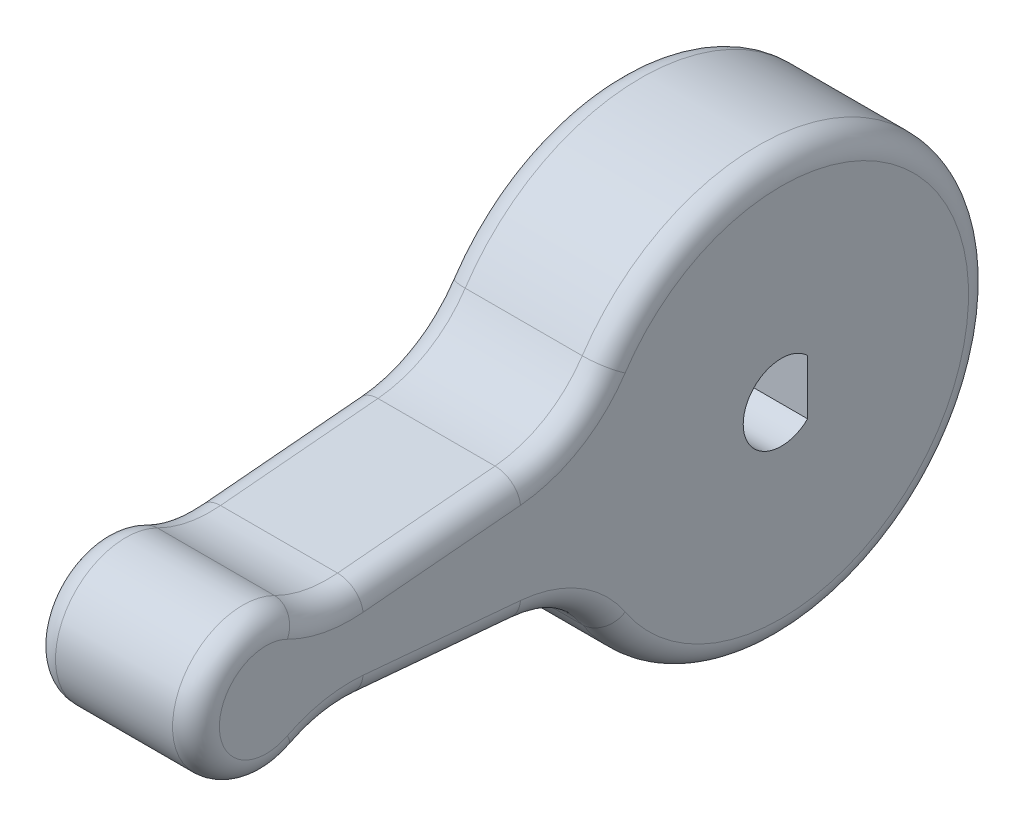
ISO-10303-21;
HEADER;
FILE_DESCRIPTION(('STEP AP214'),'2;1');
FILE_NAME('part.step','',(''),(''),'','','');
FILE_SCHEMA(('AUTOMOTIVE_DESIGN { 1 0 10303 214 1 1 1 1 }'));
ENDSEC;
DATA;
#1=APPLICATION_CONTEXT('core data for automotive mechanical design processes');
#2=APPLICATION_PROTOCOL_DEFINITION('international standard','automotive_design',2000,#1);
#3=PRODUCT_CONTEXT('',#1,'mechanical');
#4=PRODUCT('Part','Part','',(#3));
#5=PRODUCT_RELATED_PRODUCT_CATEGORY('part','',(#4));
#6=PRODUCT_DEFINITION_FORMATION('','',#4);
#7=PRODUCT_DEFINITION_CONTEXT('part definition',#1,'design');
#8=PRODUCT_DEFINITION('design','',#6,#7);
#9=PRODUCT_DEFINITION_SHAPE('','',#8);
#10=(LENGTH_UNIT() NAMED_UNIT(*) SI_UNIT(.MILLI.,.METRE.));
#11=(NAMED_UNIT(*) PLANE_ANGLE_UNIT() SI_UNIT($,.RADIAN.));
#12=(NAMED_UNIT(*) SI_UNIT($,.STERADIAN.) SOLID_ANGLE_UNIT());
#13=UNCERTAINTY_MEASURE_WITH_UNIT(LENGTH_MEASURE(1.E-05),#10,'distance_accuracy_value','');
#14=(GEOMETRIC_REPRESENTATION_CONTEXT(3) GLOBAL_UNCERTAINTY_ASSIGNED_CONTEXT((#13)) GLOBAL_UNIT_ASSIGNED_CONTEXT((#10,
#11,#12)) REPRESENTATION_CONTEXT('',''));
#15=CARTESIAN_POINT('',(0.,0.,0.));
#16=DIRECTION('',(0.,0.,1.));
#17=DIRECTION('',(1.,0.,0.));
#18=AXIS2_PLACEMENT_3D('',#15,#16,#17);
#19=CARTESIAN_POINT('',(3.5,-1.17260393995586,-1.125));
#20=DIRECTION('',(0.,0.,1.));
#21=DIRECTION('',(1.,0.,0.));
#22=AXIS2_PLACEMENT_3D('',#19,#20,#21);
#23=PLANE('',#22);
#24=CARTESIAN_POINT('',(0.,0.,-1.125));
#25=DIRECTION('',(0.,0.,1.));
#26=DIRECTION('',(1.,0.,0.));
#27=AXIS2_PLACEMENT_3D('',#24,#25,#26);
#28=CIRCLE('',#27,1.25000000000001);
#29=CARTESIAN_POINT('',(-0.433012701892256,1.17260393995586,-1.125));
#30=VERTEX_POINT('',#29);
#31=CARTESIAN_POINT('',(-0.433012701892256,-1.17260393995586,-1.125));
#32=VERTEX_POINT('',#31);
#33=EDGE_CURVE('E183',#30,#32,#28,.T.);
#34=ORIENTED_EDGE('',*,*,#33,.F.);
#35=DIRECTION('',(-1.,0.,0.));
#36=VECTOR('',#35,1.);
#37=CARTESIAN_POINT('',(3.5,1.17260393995586,-1.125));
#38=LINE('',#37,#36);
#39=CARTESIAN_POINT('',(-3.5,1.17260393995586,-1.125));
#40=VERTEX_POINT('',#39);
#41=EDGE_CURVE('E271',#30,#40,#38,.T.);
#42=ORIENTED_EDGE('',*,*,#41,.T.);
#43=DIRECTION('',(0.,1.,0.));
#44=VECTOR('',#43,1.);
#45=CARTESIAN_POINT('',(-3.5,-1.17260393995586,-1.125));
#46=LINE('',#45,#44);
#47=CARTESIAN_POINT('',(-3.5,-1.17260393995586,-1.125));
#48=VERTEX_POINT('',#47);
#49=EDGE_CURVE('E279',#48,#40,#46,.T.);
#50=ORIENTED_EDGE('',*,*,#49,.F.);
#51=DIRECTION('',(-1.,0.,0.));
#52=VECTOR('',#51,1.);
#53=CARTESIAN_POINT('',(3.5,-1.17260393995586,-1.125));
#54=LINE('',#53,#52);
#55=EDGE_CURVE('E204',#32,#48,#54,.T.);
#56=ORIENTED_EDGE('',*,*,#55,.F.);
#57=EDGE_LOOP('',(#34,#42,#50,#56));
#58=FACE_BOUND('',#57,.T.);
#59=ADVANCED_FACE('F39',(#58),#23,.T.);
#60=CARTESIAN_POINT('',(3.5,0.,22.));
#61=DIRECTION('',(1.,0.,0.));
#62=DIRECTION('',(0.,0.,-1.));
#63=AXIS2_PLACEMENT_3D('',#60,#61,#62);
#64=PLANE('',#63);
#65=DIRECTION('',(0.,-0.0883166331463126,-0.996092451687944));
#66=VECTOR('',#65,1.);
#67=CARTESIAN_POINT('',(3.5,-1.76091024104088,11.1376464782722));
#68=LINE('',#67,#66);
#69=CARTESIAN_POINT('',(3.5,-1.16454075951636,17.863889517672));
#70=VERTEX_POINT('',#69);
#71=CARTESIAN_POINT('',(3.5,-1.76091024104088,11.1376464782722));
#72=VERTEX_POINT('',#71);
#73=EDGE_CURVE('E56',#70,#72,#68,.T.);
#74=ORIENTED_EDGE('',*,*,#73,.T.);
#75=CARTESIAN_POINT('',(3.5,-7.73746495116854,11.6675462771501));
#76=DIRECTION('',(1.,0.,0.));
#77=DIRECTION('',(0.,0.,-1.));
#78=AXIS2_PLACEMENT_3D('',#75,#76,#77);
#79=CIRCLE('',#78,6.);
#80=CARTESIAN_POINT('',(3.5,-4.42140854352488,6.66716930122861));
#81=VERTEX_POINT('',#80);
#82=EDGE_CURVE('E490',#72,#81,#79,.F.);
#83=ORIENTED_EDGE('',*,*,#82,.T.);
#84=CARTESIAN_POINT('',(3.5,0.,0.));
#85=DIRECTION('',(1.,0.,0.));
#86=DIRECTION('',(0.,0.,-1.));
#87=AXIS2_PLACEMENT_3D('',#84,#85,#86);
#88=CIRCLE('',#87,8.);
#89=CARTESIAN_POINT('',(3.5,4.42140854352488,6.66716930122861));
#90=VERTEX_POINT('',#89);
#91=EDGE_CURVE('E350',#81,#90,#88,.T.);
#92=ORIENTED_EDGE('',*,*,#91,.T.);
#93=CARTESIAN_POINT('',(3.5,7.73746495116854,11.6675462771501));
#94=DIRECTION('',(1.,0.,0.));
#95=DIRECTION('',(0.,0.,-1.));
#96=AXIS2_PLACEMENT_3D('',#93,#94,#95);
#97=CIRCLE('',#96,6.);
#98=CARTESIAN_POINT('',(3.5,1.76091024104088,11.1376464782722));
#99=VERTEX_POINT('',#98);
#100=EDGE_CURVE('E481',#90,#99,#97,.F.);
#101=ORIENTED_EDGE('',*,*,#100,.T.);
#102=DIRECTION('',(0.,-0.0883166331463126,0.996092451687944));
#103=VECTOR('',#102,1.);
#104=CARTESIAN_POINT('',(3.5,1.16454075951637,17.863889517672));
#105=LINE('',#104,#103);
#106=CARTESIAN_POINT('',(3.5,1.16454075951637,17.863889517672));
#107=VERTEX_POINT('',#106);
#108=EDGE_CURVE('E483',#99,#107,#105,.T.);
#109=ORIENTED_EDGE('',*,*,#108,.T.);
#110=CARTESIAN_POINT('',(3.5,7.14109546964403,18.3937893165499));
#111=DIRECTION('',(1.,0.,0.));
#112=DIRECTION('',(0.,0.,-1.));
#113=AXIS2_PLACEMENT_3D('',#110,#111,#112);
#114=CIRCLE('',#113,6.);
#115=CARTESIAN_POINT('',(3.5,1.78527386741101,21.0984473291375));
#116=VERTEX_POINT('',#115);
#117=EDGE_CURVE('E464',#107,#116,#114,.F.);
#118=ORIENTED_EDGE('',*,*,#117,.T.);
#119=CARTESIAN_POINT('',(3.5,0.,22.));
#120=DIRECTION('',(1.,0.,0.));
#121=DIRECTION('',(0.,0.,-1.));
#122=AXIS2_PLACEMENT_3D('',#119,#120,#121);
#123=CIRCLE('',#122,2.);
#124=CARTESIAN_POINT('',(3.5,-1.78527386741101,21.0984473291375));
#125=VERTEX_POINT('',#124);
#126=EDGE_CURVE('E486',#116,#125,#123,.T.);
#127=ORIENTED_EDGE('',*,*,#126,.T.);
#128=CARTESIAN_POINT('',(3.5,-7.14109546964403,18.3937893165499));
#129=DIRECTION('',(1.,0.,0.));
#130=DIRECTION('',(0.,0.,-1.));
#131=AXIS2_PLACEMENT_3D('',#128,#129,#130);
#132=CIRCLE('',#131,6.);
#133=EDGE_CURVE('E61',#125,#70,#132,.F.);
#134=ORIENTED_EDGE('',*,*,#133,.T.);
#135=EDGE_LOOP('',(#74,#83,#92,#101,#109,#118,#127,#134));
#136=FACE_BOUND('',#135,.T.);
#137=DIRECTION('',(0.,1.,0.));
#138=VECTOR('',#137,1.);
#139=CARTESIAN_POINT('',(3.5,-1.17260393995586,-1.125));
#140=LINE('',#139,#138);
#141=CARTESIAN_POINT('',(3.5,-1.17260393995586,-1.125));
#142=VERTEX_POINT('',#141);
#143=CARTESIAN_POINT('',(3.5,1.17260393995586,-1.125));
#144=VERTEX_POINT('',#143);
#145=EDGE_CURVE('E277',#142,#144,#140,.T.);
#146=ORIENTED_EDGE('',*,*,#145,.F.);
#147=CARTESIAN_POINT('',(3.5,0.,0.));
#148=DIRECTION('',(1.,0.,0.));
#149=DIRECTION('',(0.,0.,-1.));
#150=AXIS2_PLACEMENT_3D('',#147,#148,#149);
#151=CIRCLE('',#150,1.625);
#152=EDGE_CURVE('E201',#144,#142,#151,.T.);
#153=ORIENTED_EDGE('',*,*,#152,.F.);
#154=EDGE_LOOP('',(#146,#153));
#155=FACE_BOUND('',#154,.T.);
#156=ADVANCED_FACE('F263',(#136,#155),#64,.T.);
#157=CARTESIAN_POINT('',(-3.5,0.,22.));
#158=DIRECTION('',(1.,0.,0.));
#159=DIRECTION('',(0.,0.,-1.));
#160=AXIS2_PLACEMENT_3D('',#157,#158,#159);
#161=PLANE('',#160);
#162=CARTESIAN_POINT('',(-3.5,0.,0.));
#163=DIRECTION('',(1.,0.,0.));
#164=DIRECTION('',(0.,0.,-1.));
#165=AXIS2_PLACEMENT_3D('',#162,#163,#164);
#166=CIRCLE('',#165,8.);
#167=CARTESIAN_POINT('',(-3.5,4.42140854352488,6.66716930122861));
#168=VERTEX_POINT('',#167);
#169=CARTESIAN_POINT('',(-3.5,-4.42140854352488,6.66716930122861));
#170=VERTEX_POINT('',#169);
#171=EDGE_CURVE('E307',#168,#170,#166,.F.);
#172=ORIENTED_EDGE('',*,*,#171,.T.);
#173=CARTESIAN_POINT('',(-3.5,-7.73746495116854,11.6675462771501));
#174=DIRECTION('',(1.,0.,0.));
#175=DIRECTION('',(0.,0.,-1.));
#176=AXIS2_PLACEMENT_3D('',#173,#174,#175);
#177=CIRCLE('',#176,6.);
#178=CARTESIAN_POINT('',(-3.5,-1.76091024104088,11.1376464782722));
#179=VERTEX_POINT('',#178);
#180=EDGE_CURVE('E345',#170,#179,#177,.T.);
#181=ORIENTED_EDGE('',*,*,#180,.T.);
#182=DIRECTION('',(0.,-0.0883166331463126,-0.996092451687944));
#183=VECTOR('',#182,1.);
#184=CARTESIAN_POINT('',(-3.5,-0.791597568109625,22.0701854851965));
#185=LINE('',#184,#183);
#186=CARTESIAN_POINT('',(-3.5,-1.16454075951637,17.863889517672));
#187=VERTEX_POINT('',#186);
#188=EDGE_CURVE('E512',#179,#187,#185,.F.);
#189=ORIENTED_EDGE('',*,*,#188,.T.);
#190=CARTESIAN_POINT('',(-3.5,-7.14109546964403,18.3937893165499));
#191=DIRECTION('',(1.,0.,0.));
#192=DIRECTION('',(0.,0.,-1.));
#193=AXIS2_PLACEMENT_3D('',#190,#191,#192);
#194=CIRCLE('',#193,6.);
#195=CARTESIAN_POINT('',(-3.5,-1.78527386741101,21.0984473291375));
#196=VERTEX_POINT('',#195);
#197=EDGE_CURVE('E510',#187,#196,#194,.T.);
#198=ORIENTED_EDGE('',*,*,#197,.T.);
#199=CARTESIAN_POINT('',(-3.5,0.,22.));
#200=DIRECTION('',(1.,0.,0.));
#201=DIRECTION('',(0.,0.,-1.));
#202=AXIS2_PLACEMENT_3D('',#199,#200,#201);
#203=CIRCLE('',#202,2.);
#204=CARTESIAN_POINT('',(-3.5,1.78527386741101,21.0984473291375));
#205=VERTEX_POINT('',#204);
#206=EDGE_CURVE('E508',#196,#205,#203,.F.);
#207=ORIENTED_EDGE('',*,*,#206,.T.);
#208=CARTESIAN_POINT('',(-3.5,7.14109546964403,18.3937893165499));
#209=DIRECTION('',(1.,0.,0.));
#210=DIRECTION('',(0.,0.,-1.));
#211=AXIS2_PLACEMENT_3D('',#208,#209,#210);
#212=CIRCLE('',#211,6.);
#213=CARTESIAN_POINT('',(-3.5,1.16454075951637,17.863889517672));
#214=VERTEX_POINT('',#213);
#215=EDGE_CURVE('E504',#205,#214,#212,.T.);
#216=ORIENTED_EDGE('',*,*,#215,.T.);
#217=DIRECTION('',(0.,-0.0883166331463126,0.996092451687944));
#218=VECTOR('',#217,1.);
#219=CARTESIAN_POINT('',(-3.5,0.791597568109625,22.0701854851965));
#220=LINE('',#219,#218);
#221=CARTESIAN_POINT('',(-3.5,1.76091024104087,11.1376464782722));
#222=VERTEX_POINT('',#221);
#223=EDGE_CURVE('E503',#214,#222,#220,.F.);
#224=ORIENTED_EDGE('',*,*,#223,.T.);
#225=CARTESIAN_POINT('',(-3.5,7.73746495116854,11.6675462771501));
#226=DIRECTION('',(1.,0.,0.));
#227=DIRECTION('',(0.,0.,-1.));
#228=AXIS2_PLACEMENT_3D('',#225,#226,#227);
#229=CIRCLE('',#228,6.);
#230=EDGE_CURVE('E501',#222,#168,#229,.T.);
#231=ORIENTED_EDGE('',*,*,#230,.T.);
#232=EDGE_LOOP('',(#172,#181,#189,#198,#207,#216,#224,#231));
#233=FACE_BOUND('',#232,.T.);
#234=CARTESIAN_POINT('',(-3.5,0.,0.));
#235=DIRECTION('',(1.,0.,0.));
#236=DIRECTION('',(0.,0.,-1.));
#237=AXIS2_PLACEMENT_3D('',#234,#235,#236);
#238=CIRCLE('',#237,1.625);
#239=EDGE_CURVE('E275',#40,#48,#238,.T.);
#240=ORIENTED_EDGE('',*,*,#239,.T.);
#241=ORIENTED_EDGE('',*,*,#49,.T.);
#242=EDGE_LOOP('',(#240,#241));
#243=FACE_BOUND('',#242,.T.);
#244=ADVANCED_FACE('F268',(#233,#243),#161,.F.);
#245=CARTESIAN_POINT('',(3.5,0.,22.));
#246=DIRECTION('',(-1.,0.,0.));
#247=DIRECTION('',(0.,0.,1.));
#248=AXIS2_PLACEMENT_3D('',#245,#246,#247);
#249=CYLINDRICAL_SURFACE('',#248,3.);
#250=DIRECTION('',(-1.,0.,0.));
#251=VECTOR('',#250,1.);
#252=CARTESIAN_POINT('',(3.5,2.67791080111651,20.6476709937062));
#253=LINE('',#252,#251);
#254=CARTESIAN_POINT('',(2.5,2.67791080111651,20.6476709937062));
#255=VERTEX_POINT('',#254);
#256=CARTESIAN_POINT('',(-2.5,2.67791080111651,20.6476709937062));
#257=VERTEX_POINT('',#256);
#258=EDGE_CURVE('E207',#255,#257,#253,.T.);
#259=ORIENTED_EDGE('',*,*,#258,.T.);
#260=CARTESIAN_POINT('',(-2.5,0.,22.));
#261=DIRECTION('',(1.,0.,0.));
#262=DIRECTION('',(0.,0.,-1.));
#263=AXIS2_PLACEMENT_3D('',#260,#261,#262);
#264=CIRCLE('',#263,3.);
#265=CARTESIAN_POINT('',(-2.5,-2.67791080111651,20.6476709937062));
#266=VERTEX_POINT('',#265);
#267=EDGE_CURVE('E527',#257,#266,#264,.T.);
#268=ORIENTED_EDGE('',*,*,#267,.T.);
#269=DIRECTION('',(-1.,0.,0.));
#270=VECTOR('',#269,1.);
#271=CARTESIAN_POINT('',(3.5,-2.67791080111651,20.6476709937062));
#272=LINE('',#271,#270);
#273=CARTESIAN_POINT('',(2.5,-2.67791080111651,20.6476709937062));
#274=VERTEX_POINT('',#273);
#275=EDGE_CURVE('E203',#266,#274,#272,.F.);
#276=ORIENTED_EDGE('',*,*,#275,.T.);
#277=CARTESIAN_POINT('',(2.5,0.,22.));
#278=DIRECTION('',(1.,0.,0.));
#279=DIRECTION('',(0.,0.,-1.));
#280=AXIS2_PLACEMENT_3D('',#277,#278,#279);
#281=CIRCLE('',#280,3.);
#282=EDGE_CURVE('E525',#274,#255,#281,.F.);
#283=ORIENTED_EDGE('',*,*,#282,.T.);
#284=EDGE_LOOP('',(#259,#268,#276,#283));
#285=FACE_BOUND('',#284,.T.);
#286=ADVANCED_FACE('F284',(#285),#249,.T.);
#287=CARTESIAN_POINT('',(3.5,-2.,19.7639320225002));
#288=DIRECTION('',(0.,0.996092451687944,-0.0883166331463126));
#289=DIRECTION('',(0.,0.0883166331463126,0.996092451687944));
#290=AXIS2_PLACEMENT_3D('',#287,#288,#289);
#291=PLANE('',#290);
#292=DIRECTION('',(1.,0.,0.));
#293=VECTOR('',#292,1.);
#294=CARTESIAN_POINT('',(-3.5,-2.16063321120431,17.9522061508184));
#295=LINE('',#294,#293);
#296=CARTESIAN_POINT('',(2.5,-2.16063321120431,17.9522061508184));
#297=VERTEX_POINT('',#296);
#298=CARTESIAN_POINT('',(-2.5,-2.16063321120431,17.9522061508184));
#299=VERTEX_POINT('',#298);
#300=EDGE_CURVE('E226',#297,#299,#295,.F.);
#301=ORIENTED_EDGE('',*,*,#300,.T.);
#302=DIRECTION('',(0.,-0.0883166331463126,-0.996092451687944));
#303=VECTOR('',#302,1.);
#304=CARTESIAN_POINT('',(-2.5,-2.,19.7639320225002));
#305=LINE('',#304,#303);
#306=CARTESIAN_POINT('',(-2.5,-2.75700269272882,11.2259631114185));
#307=VERTEX_POINT('',#306);
#308=EDGE_CURVE('E519',#299,#307,#305,.T.);
#309=ORIENTED_EDGE('',*,*,#308,.T.);
#310=DIRECTION('',(1.,0.,0.));
#311=VECTOR('',#310,1.);
#312=CARTESIAN_POINT('',(3.5,-2.75700269272882,11.2259631114185));
#313=LINE('',#312,#311);
#314=CARTESIAN_POINT('',(2.5,-2.75700269272882,11.2259631114185));
#315=VERTEX_POINT('',#314);
#316=EDGE_CURVE('E188',#307,#315,#313,.T.);
#317=ORIENTED_EDGE('',*,*,#316,.T.);
#318=DIRECTION('',(0.,-0.0883166331463126,-0.996092451687944));
#319=VECTOR('',#318,1.);
#320=CARTESIAN_POINT('',(2.5,-2.16063321120431,17.9522061508184));
#321=LINE('',#320,#319);
#322=EDGE_CURVE('E517',#315,#297,#321,.F.);
#323=ORIENTED_EDGE('',*,*,#322,.T.);
#324=EDGE_LOOP('',(#301,#309,#317,#323));
#325=FACE_BOUND('',#324,.T.);
#326=ADVANCED_FACE('F290',(#325),#291,.F.);
#327=CARTESIAN_POINT('',(3.5,0.,0.));
#328=DIRECTION('',(-1.,0.,0.));
#329=DIRECTION('',(0.,0.,1.));
#330=AXIS2_PLACEMENT_3D('',#327,#328,#329);
#331=CYLINDRICAL_SURFACE('',#330,9.);
#332=CARTESIAN_POINT('',(-1.75000000000001,0.,-9.));
#333=CARTESIAN_POINT('',(-1.74999635550139,-0.09731568360621,-8.99999821772445));
#334=CARTESIAN_POINT('',(-1.7418551349126,-0.194678040802688,-8.99840536590685));
#335=CARTESIAN_POINT('',(-1.70952900291503,-0.386654525996946,-8.99220475390969));
#336=CARTESIAN_POINT('',(-1.68533098644291,-0.481266343194964,-8.98759453108666));
#337=CARTESIAN_POINT('',(-1.62166396720999,-0.66493799640968,-8.97587438816909));
#338=CARTESIAN_POINT('',(-1.58220921495264,-0.754002923611571,-8.96876680129341));
#339=CARTESIAN_POINT('',(-1.48919019886731,-0.924241885844083,-8.95282616245856));
#340=CARTESIAN_POINT('',(-1.4356269111316,-1.00541646623288,-8.94399322987754));
#341=CARTESIAN_POINT('',(-1.31518198455533,-1.15861949618252,-8.92544854462387));
#342=CARTESIAN_POINT('',(-1.24815429147635,-1.23053205090739,-8.91572785496434));
#343=CARTESIAN_POINT('',(-1.1029972919613,-1.36216658793174,-8.89656884633763));
#344=CARTESIAN_POINT('',(-1.02486715126919,-1.42188765332039,-8.88713054865443));
#345=CARTESIAN_POINT('',(-0.858896028885129,-1.52793216432716,-8.86951788037707));
#346=CARTESIAN_POINT('',(-0.770977652173529,-1.57413655878562,-8.86135501974221));
#347=CARTESIAN_POINT('',(-0.588440829117896,-1.65107372787244,-8.84734393358533));
#348=CARTESIAN_POINT('',(-0.493823007380693,-1.68180794266538,-8.841495492618));
#349=CARTESIAN_POINT('',(-0.301817000522478,-1.72655801443225,-8.83286564018682));
#350=CARTESIAN_POINT('',(-0.20447778329941,-1.74077666208468,-8.83004705858871));
#351=CARTESIAN_POINT('',(-0.00875769977991777,-1.75272167469912,-8.82768409246149));
#352=CARTESIAN_POINT('',(0.0896230650338509,-1.75044963192148,-8.82813939182243));
#353=CARTESIAN_POINT('',(0.283156475050361,-1.72964193315877,-8.8322389411357));
#354=CARTESIAN_POINT('',(0.37833512787534,-1.71133789823937,-8.83583777311583));
#355=CARTESIAN_POINT('',(0.564244404389784,-1.65935102622046,-8.84574745533293));
#356=CARTESIAN_POINT('',(0.654974825992275,-1.62566749113264,-8.85205842865784));
#357=CARTESIAN_POINT('',(0.830084250240825,-1.5436541923873,-8.8667282121507));
#358=CARTESIAN_POINT('',(0.91441876817963,-1.4952318468512,-8.87509990120757));
#359=CARTESIAN_POINT('',(1.07385251221273,-1.38518085205731,-8.89293945847091));
#360=CARTESIAN_POINT('',(1.14895073148455,-1.32355076506606,-8.90240744596371));
#361=CARTESIAN_POINT('',(1.28911741328955,-1.18758968951823,-8.92157007269816));
#362=CARTESIAN_POINT('',(1.35399393210437,-1.11306082058522,-8.93126583077738));
#363=CARTESIAN_POINT('',(1.47035368952896,-0.95407742156916,-8.94964408707819));
#364=CARTESIAN_POINT('',(1.52183677391922,-0.869622777211414,-8.95832657363176));
#365=CARTESIAN_POINT('',(1.60998047780072,-0.692977848986437,-8.97371958042028));
#366=CARTESIAN_POINT('',(1.64662005037704,-0.600776803288877,-8.98042729693397));
#367=CARTESIAN_POINT('',(1.70383681200454,-0.411368845280853,-8.99109353993251));
#368=CARTESIAN_POINT('',(1.72441583833935,-0.314162506919116,-8.99505238087568));
#369=CARTESIAN_POINT('',(1.74865766895005,-0.119153602899694,-8.99973129619662));
#370=CARTESIAN_POINT('',(1.75258329219557,-0.0213848777429239,-9.00050168497024));
#371=CARTESIAN_POINT('',(1.74411341290413,0.173411693275196,-8.99885629934295));
#372=CARTESIAN_POINT('',(1.73171877541398,0.270439578130224,-8.99644069381397));
#373=CARTESIAN_POINT('',(1.6911786379996,0.460158769259969,-8.98872615509347));
#374=CARTESIAN_POINT('',(1.66316714764133,0.552879796620061,-8.98345176395529));
#375=CARTESIAN_POINT('',(1.59233424474405,0.732309171756707,-8.97060876056953));
#376=CARTESIAN_POINT('',(1.54951176873455,0.819017087238037,-8.9630399835834));
#377=CARTESIAN_POINT('',(1.44969797272437,0.985073318514114,-8.94632234279119));
#378=CARTESIAN_POINT('',(1.39254735361879,1.06432409538848,-8.93715609353275));
#379=CARTESIAN_POINT('',(1.26591388320944,1.21220480902887,-8.91830290791195));
#380=CARTESIAN_POINT('',(1.19642978714922,1.2808336724681,-8.90861591906278));
#381=CARTESIAN_POINT('',(1.04590826110141,1.40652971644422,-8.88964464547266));
#382=CARTESIAN_POINT('',(0.964719413349126,1.46341694552871,-8.88036812973076));
#383=CARTESIAN_POINT('',(0.7937839073255,1.56274664411422,-8.86342892548536));
#384=CARTESIAN_POINT('',(0.704037581254623,1.60518967404562,-8.85576617437269));
#385=CARTESIAN_POINT('',(0.518974976055549,1.67417620220868,-8.84298404690308));
#386=CARTESIAN_POINT('',(0.423689421456823,1.70079964467829,-8.83785190492785));
#387=CARTESIAN_POINT('',(0.229887548852041,1.73763563092624,-8.83068405262817));
#388=CARTESIAN_POINT('',(0.13137162777269,1.74785018327052,-8.82864796332627));
#389=CARTESIAN_POINT('',(-0.0642896729854845,1.75150730296478,-8.82792297326674));
#390=CARTESIAN_POINT('',(-0.161429644425239,1.74523399190087,-8.82917736959248));
#391=CARTESIAN_POINT('',(-0.353241751066479,1.71671825425597,-8.83476575384817));
#392=CARTESIAN_POINT('',(-0.447913903725893,1.69447594067524,-8.83909971998639));
#393=CARTESIAN_POINT('',(-0.631934818578739,1.63477724493334,-8.85033422418497));
#394=CARTESIAN_POINT('',(-0.721294649408393,1.59735386574453,-8.85722919201355));
#395=CARTESIAN_POINT('',(-0.892512071669416,1.50838724827546,-8.87281232352071));
#396=CARTESIAN_POINT('',(-0.97436907771755,1.45684290950313,-8.88150062694672));
#397=CARTESIAN_POINT('',(-1.12967583654032,1.34011926319956,-8.89986611414857));
#398=CARTESIAN_POINT('',(-1.2029692463084,1.27473404504483,-8.90955695190391));
#399=CARTESIAN_POINT('',(-1.33763818837011,1.13261176790832,-8.92873573916035));
#400=CARTESIAN_POINT('',(-1.39901097930668,1.05587210490262,-8.93822364154751));
#401=CARTESIAN_POINT('',(-1.50866158478036,0.892317108276778,-8.95603687130174));
#402=CARTESIAN_POINT('',(-1.55680523743856,0.805410441012039,-8.96434990016989));
#403=CARTESIAN_POINT('',(-1.63772988659885,0.624605421667272,-8.97875614908294));
#404=CARTESIAN_POINT('',(-1.67052499459617,0.530713584204257,-8.98485140700041));
#405=CARTESIAN_POINT('',(-1.71333078209158,0.363817397281656,-8.99292466438293));
#406=CARTESIAN_POINT('',(-1.72705768473959,0.291775007462716,-8.99556263471093));
#407=CARTESIAN_POINT('',(-1.74539353403689,0.146497206166159,-8.99910094833246));
#408=CARTESIAN_POINT('',(-1.75000274367529,0.073261829160287,-9.00000134174433));
#409=CARTESIAN_POINT('',(-1.75000000000001,0.,-9.));
#410=B_SPLINE_CURVE_WITH_KNOTS('',3,(#332,#333,#334,#335,#336,#337,#338,#339,#340,#341,#342,
#343,#344,#345,#346,#347,#348,#349,#350,#351,#352,#353,#354,#355,#356,#357,#358,#359,#360,#361,
#362,#363,#364,#365,#366,#367,#368,#369,#370,#371,#372,#373,#374,#375,#376,#377,#378,#379,#380,
#381,#382,#383,#384,#385,#386,#387,#388,#389,#390,#391,#392,#393,#394,#395,#396,#397,#398,#399,
#400,#401,#402,#403,#404,#405,#406,#407,#408,#409),.UNSPECIFIED.,.T.,.F.,(4,2,2,2,2,2,2,2,2,2,2,
2,2,2,2,2,2,2,2,2,2,2,2,2,2,2,2,2,2,2,2,2,2,2,2,2,2,2,4),(0.,0.29167907832698,0.583596509446679,
0.87524193212375,1.1668671827495,1.46184556749474,1.75684612912921,2.05437172284607,
2.35186961390439,2.64567463922138,2.93945129654079,3.22905237385877,3.51866659583438,
3.81013894721943,4.1016430430633,4.39809655637104,4.69455348305976,4.99142930303901,
5.28827115623633,5.58041049779948,5.87253435529425,6.16218922130505,6.45186488967035,
6.74491624829811,7.03799719997533,7.33528189387185,7.63255505190067,7.92831287468508,
8.22403449182954,8.51469373248327,8.80535091638693,9.09537958194333,9.38543085680492,
9.68014586459751,9.97492856728059,10.2725988388052,10.5699948911837,10.789584975771,
11.0091687264487),.UNSPECIFIED.);
#411=CARTESIAN_POINT('',(-1.75000000000001,0.,-9.));
#412=VERTEX_POINT('',#411);
#413=EDGE_CURVE('E273',#412,#412,#410,.T.);
#414=ORIENTED_EDGE('',*,*,#413,.T.);
#415=EDGE_LOOP('',(#414));
#416=FACE_BOUND('',#415,.T.);
#417=DIRECTION('',(-1.,0.,0.));
#418=VECTOR('',#417,1.);
#419=CARTESIAN_POINT('',(3.5,-4.97408461146549,7.50056546388219));
#420=LINE('',#419,#418);
#421=CARTESIAN_POINT('',(2.5,-4.97408461146549,7.50056546388219));
#422=VERTEX_POINT('',#421);
#423=CARTESIAN_POINT('',(-2.5,-4.97408461146549,7.50056546388219));
#424=VERTEX_POINT('',#423);
#425=EDGE_CURVE('E223',#422,#424,#420,.T.);
#426=ORIENTED_EDGE('',*,*,#425,.T.);
#427=CARTESIAN_POINT('',(-2.5,0.,0.));
#428=DIRECTION('',(1.,0.,0.));
#429=DIRECTION('',(0.,0.,-1.));
#430=AXIS2_PLACEMENT_3D('',#427,#428,#429);
#431=CIRCLE('',#430,9.);
#432=CARTESIAN_POINT('',(-2.5,4.97408461146549,7.50056546388219));
#433=VERTEX_POINT('',#432);
#434=EDGE_CURVE('E11',#424,#433,#431,.T.);
#435=ORIENTED_EDGE('',*,*,#434,.T.);
#436=DIRECTION('',(-1.,0.,0.));
#437=VECTOR('',#436,1.);
#438=CARTESIAN_POINT('',(3.5,4.97408461146549,7.50056546388219));
#439=LINE('',#438,#437);
#440=CARTESIAN_POINT('',(2.5,4.97408461146549,7.50056546388219));
#441=VERTEX_POINT('',#440);
#442=EDGE_CURVE('E220',#433,#441,#439,.F.);
#443=ORIENTED_EDGE('',*,*,#442,.T.);
#444=CARTESIAN_POINT('',(2.5,0.,0.));
#445=DIRECTION('',(1.,0.,0.));
#446=DIRECTION('',(0.,0.,-1.));
#447=AXIS2_PLACEMENT_3D('',#444,#445,#446);
#448=CIRCLE('',#447,9.);
#449=EDGE_CURVE('E48',#441,#422,#448,.F.);
#450=ORIENTED_EDGE('',*,*,#449,.T.);
#451=EDGE_LOOP('',(#426,#435,#443,#450));
#452=FACE_BOUND('',#451,.T.);
#453=ADVANCED_FACE('F296',(#416,#452),#331,.T.);
#454=CARTESIAN_POINT('',(3.5,2.,19.7639320225002));
#455=DIRECTION('',(0.,-0.996092451687944,-0.0883166331463126));
#456=DIRECTION('',(0.,0.0883166331463126,-0.996092451687944));
#457=AXIS2_PLACEMENT_3D('',#454,#455,#456);
#458=PLANE('',#457);
#459=DIRECTION('',(1.,0.,0.));
#460=VECTOR('',#459,1.);
#461=CARTESIAN_POINT('',(-3.5,2.75700269272882,11.2259631114185));
#462=LINE('',#461,#460);
#463=CARTESIAN_POINT('',(2.5,2.75700269272882,11.2259631114185));
#464=VERTEX_POINT('',#463);
#465=CARTESIAN_POINT('',(-2.5,2.75700269272882,11.2259631114185));
#466=VERTEX_POINT('',#465);
#467=EDGE_CURVE('E214',#464,#466,#462,.F.);
#468=ORIENTED_EDGE('',*,*,#467,.T.);
#469=DIRECTION('',(0.,-0.0883166331463126,0.996092451687944));
#470=VECTOR('',#469,1.);
#471=CARTESIAN_POINT('',(-2.5,2.,19.7639320225002));
#472=LINE('',#471,#470);
#473=CARTESIAN_POINT('',(-2.5,2.16063321120431,17.9522061508184));
#474=VERTEX_POINT('',#473);
#475=EDGE_CURVE('E469',#466,#474,#472,.T.);
#476=ORIENTED_EDGE('',*,*,#475,.T.);
#477=DIRECTION('',(1.,0.,0.));
#478=VECTOR('',#477,1.);
#479=CARTESIAN_POINT('',(3.5,2.16063321120431,17.9522061508184));
#480=LINE('',#479,#478);
#481=CARTESIAN_POINT('',(2.5,2.16063321120431,17.9522061508184));
#482=VERTEX_POINT('',#481);
#483=EDGE_CURVE('E217',#474,#482,#480,.T.);
#484=ORIENTED_EDGE('',*,*,#483,.T.);
#485=DIRECTION('',(0.,-0.0883166331463126,0.996092451687944));
#486=VECTOR('',#485,1.);
#487=CARTESIAN_POINT('',(2.5,2.75700269272882,11.2259631114185));
#488=LINE('',#487,#486);
#489=EDGE_CURVE('E466',#482,#464,#488,.F.);
#490=ORIENTED_EDGE('',*,*,#489,.T.);
#491=EDGE_LOOP('',(#468,#476,#484,#490));
#492=FACE_BOUND('',#491,.T.);
#493=ADVANCED_FACE('F261',(#492),#458,.F.);
#494=CARTESIAN_POINT('',(3.5,0.,0.));
#495=DIRECTION('',(-1.,0.,0.));
#496=DIRECTION('',(0.,0.,1.));
#497=AXIS2_PLACEMENT_3D('',#494,#495,#496);
#498=CYLINDRICAL_SURFACE('',#497,1.625);
#499=CARTESIAN_POINT('',(0.433012701892259,1.17260393995586,-1.125));
#500=CARTESIAN_POINT('',(0.388768023493144,1.18897586998608,-1.1079185776334));
#501=CARTESIAN_POINT('',(0.342806576337857,1.20306553582658,-1.09249404355024));
#502=CARTESIAN_POINT('',(0.248376018208089,1.22602960728608,-1.06667170580115));
#503=CARTESIAN_POINT('',(0.199911810860088,1.23491381934592,-1.05626445678132));
#504=CARTESIAN_POINT('',(0.100751880248076,1.24694061850363,-1.04204406134735));
#505=CARTESIAN_POINT('',(0.0500391357453384,1.25002697060475,-1.03829551831675));
#506=CARTESIAN_POINT('',(-0.0513779034131249,1.24997267093549,-1.03836087894802));
#507=CARTESIAN_POINT('',(-0.102082198050982,1.24683200616,-1.04217479840408));
#508=CARTESIAN_POINT('',(-0.200996238159406,1.23472874518348,-1.05648105124319));
#509=CARTESIAN_POINT('',(-0.249230864999506,1.22584770086237,-1.06687979456448));
#510=CARTESIAN_POINT('',(-0.34321709483576,1.20293913268337,-1.09263275901859));
#511=CARTESIAN_POINT('',(-0.388964064696074,1.18890235966702,-1.10799588004124));
#512=CARTESIAN_POINT('',(-0.433012701892258,1.17260393995586,-1.12500000000001));
#513=B_SPLINE_CURVE_WITH_KNOTS('',3,(#499,#500,#501,#502,#503,#504,#505,#506,#507,#508,#509,
#510,#511,#512),.UNSPECIFIED.,.F.,.F.,(4,2,2,2,2,2,4),(0.,0.150734611716992,0.301184337099169,
0.453085927668834,0.604987835484999,0.754777786876093,0.904837778107664),.UNSPECIFIED.);
#514=CARTESIAN_POINT('',(0.433012701892256,1.17260393995586,-1.125));
#515=VERTEX_POINT('',#514);
#516=EDGE_CURVE('E187',#515,#30,#513,.T.);
#517=ORIENTED_EDGE('',*,*,#516,.F.);
#518=EDGE_CURVE('E196',#144,#515,#38,.T.);
#519=ORIENTED_EDGE('',*,*,#518,.F.);
#520=ORIENTED_EDGE('',*,*,#152,.T.);
#521=CARTESIAN_POINT('',(0.433012701892257,-1.17260393995586,-1.125));
#522=VERTEX_POINT('',#521);
#523=EDGE_CURVE('E193',#142,#522,#54,.T.);
#524=ORIENTED_EDGE('',*,*,#523,.T.);
#525=CARTESIAN_POINT('',(-0.433012701892257,-1.17260393995586,-1.125));
#526=CARTESIAN_POINT('',(-0.388768023493143,-1.18897586998608,-1.1079185776334));
#527=CARTESIAN_POINT('',(-0.342806576337856,-1.20306553582658,-1.09249404355024));
#528=CARTESIAN_POINT('',(-0.248376018208088,-1.22602960728608,-1.06667170580115));
#529=CARTESIAN_POINT('',(-0.199911810860087,-1.23491381934592,-1.05626445678132));
#530=CARTESIAN_POINT('',(-0.100751880248075,-1.24694061850363,-1.04204406134735));
#531=CARTESIAN_POINT('',(-0.0500391357453372,-1.25002697060475,-1.03829551831675));
#532=CARTESIAN_POINT('',(0.0513779034131261,-1.24997267093549,-1.03836087894802));
#533=CARTESIAN_POINT('',(0.102082198050983,-1.24683200616,-1.04217479840408));
#534=CARTESIAN_POINT('',(0.200996238159407,-1.23472874518348,-1.05648105124318));
#535=CARTESIAN_POINT('',(0.249230864999506,-1.22584770086237,-1.06687979456448));
#536=CARTESIAN_POINT('',(0.343217094835759,-1.20293913268337,-1.09263275901858));
#537=CARTESIAN_POINT('',(0.388964064696073,-1.18890235966702,-1.10799588004124));
#538=CARTESIAN_POINT('',(0.433012701892257,-1.17260393995586,-1.125));
#539=B_SPLINE_CURVE_WITH_KNOTS('',3,(#525,#526,#527,#528,#529,#530,#531,#532,#533,#534,#535,
#536,#537,#538),.UNSPECIFIED.,.F.,.F.,(4,2,2,2,2,2,4),(0.,0.150734611716992,0.301184337099169,
0.453085927668834,0.604987835484999,0.754777786876092,0.904837778107661),.UNSPECIFIED.);
#540=EDGE_CURVE('E176',#32,#522,#539,.T.);
#541=ORIENTED_EDGE('',*,*,#540,.F.);
#542=ORIENTED_EDGE('',*,*,#55,.T.);
#543=ORIENTED_EDGE('',*,*,#239,.F.);
#544=ORIENTED_EDGE('',*,*,#41,.F.);
#545=EDGE_LOOP('',(#517,#519,#520,#524,#541,#542,#543,#544));
#546=FACE_BOUND('',#545,.T.);
#547=ADVANCED_FACE('F199',(#546),#498,.F.);
#548=EDGE_CURVE('E180',#522,#515,#28,.T.);
#549=ORIENTED_EDGE('',*,*,#548,.F.);
#550=ORIENTED_EDGE('',*,*,#523,.F.);
#551=ORIENTED_EDGE('',*,*,#145,.T.);
#552=ORIENTED_EDGE('',*,*,#518,.T.);
#553=EDGE_LOOP('',(#549,#550,#551,#552));
#554=FACE_BOUND('',#553,.T.);
#555=ADVANCED_FACE('F192',(#554),#23,.T.);
#556=CARTESIAN_POINT('',(3.5,7.14109546964403,18.3937893165499));
#557=DIRECTION('',(-1.,0.,0.));
#558=DIRECTION('',(0.,0.,1.));
#559=AXIS2_PLACEMENT_3D('',#556,#557,#558);
#560=CYLINDRICAL_SURFACE('',#559,5.);
#561=ORIENTED_EDGE('',*,*,#483,.F.);
#562=CARTESIAN_POINT('',(-2.5,7.14109546964403,18.3937893165499));
#563=DIRECTION('',(1.,0.,0.));
#564=DIRECTION('',(0.,0.,-1.));
#565=AXIS2_PLACEMENT_3D('',#562,#563,#564);
#566=CIRCLE('',#565,5.);
#567=EDGE_CURVE('E470',#474,#257,#566,.F.);
#568=ORIENTED_EDGE('',*,*,#567,.T.);
#569=ORIENTED_EDGE('',*,*,#258,.F.);
#570=CARTESIAN_POINT('',(2.5,7.14109546964403,18.3937893165499));
#571=DIRECTION('',(1.,0.,0.));
#572=DIRECTION('',(0.,0.,-1.));
#573=AXIS2_PLACEMENT_3D('',#570,#571,#572);
#574=CIRCLE('',#573,5.);
#575=EDGE_CURVE('E463',#255,#482,#574,.T.);
#576=ORIENTED_EDGE('',*,*,#575,.T.);
#577=EDGE_LOOP('',(#561,#568,#569,#576));
#578=FACE_BOUND('',#577,.T.);
#579=ADVANCED_FACE('F253',(#578),#560,.F.);
#580=CARTESIAN_POINT('',(3.5,-7.73746495116854,11.6675462771501));
#581=DIRECTION('',(-1.,0.,0.));
#582=DIRECTION('',(0.,0.,1.));
#583=AXIS2_PLACEMENT_3D('',#580,#581,#582);
#584=CYLINDRICAL_SURFACE('',#583,5.);
#585=ORIENTED_EDGE('',*,*,#316,.F.);
#586=CARTESIAN_POINT('',(-2.5,-7.73746495116854,11.6675462771501));
#587=DIRECTION('',(1.,0.,0.));
#588=DIRECTION('',(0.,0.,-1.));
#589=AXIS2_PLACEMENT_3D('',#586,#587,#588);
#590=CIRCLE('',#589,5.);
#591=EDGE_CURVE('E336',#307,#424,#590,.F.);
#592=ORIENTED_EDGE('',*,*,#591,.T.);
#593=ORIENTED_EDGE('',*,*,#425,.F.);
#594=CARTESIAN_POINT('',(2.5,-7.73746495116854,11.6675462771501));
#595=DIRECTION('',(1.,0.,0.));
#596=DIRECTION('',(0.,0.,-1.));
#597=AXIS2_PLACEMENT_3D('',#594,#595,#596);
#598=CIRCLE('',#597,5.);
#599=EDGE_CURVE('E334',#422,#315,#598,.T.);
#600=ORIENTED_EDGE('',*,*,#599,.T.);
#601=EDGE_LOOP('',(#585,#592,#593,#600));
#602=FACE_BOUND('',#601,.T.);
#603=ADVANCED_FACE('F258',(#602),#584,.F.);
#604=CARTESIAN_POINT('',(3.5,-7.14109546964403,18.3937893165499));
#605=DIRECTION('',(-1.,0.,0.));
#606=DIRECTION('',(0.,0.,1.));
#607=AXIS2_PLACEMENT_3D('',#604,#605,#606);
#608=CYLINDRICAL_SURFACE('',#607,5.);
#609=ORIENTED_EDGE('',*,*,#275,.F.);
#610=CARTESIAN_POINT('',(-2.5,-7.14109546964403,18.3937893165499));
#611=DIRECTION('',(1.,0.,0.));
#612=DIRECTION('',(0.,0.,-1.));
#613=AXIS2_PLACEMENT_3D('',#610,#611,#612);
#614=CIRCLE('',#613,5.);
#615=EDGE_CURVE('E523',#266,#299,#614,.F.);
#616=ORIENTED_EDGE('',*,*,#615,.T.);
#617=ORIENTED_EDGE('',*,*,#300,.F.);
#618=CARTESIAN_POINT('',(2.5,-7.14109546964403,18.3937893165499));
#619=DIRECTION('',(1.,0.,0.));
#620=DIRECTION('',(0.,0.,-1.));
#621=AXIS2_PLACEMENT_3D('',#618,#619,#620);
#622=CIRCLE('',#621,5.);
#623=EDGE_CURVE('E521',#297,#274,#622,.T.);
#624=ORIENTED_EDGE('',*,*,#623,.T.);
#625=EDGE_LOOP('',(#609,#616,#617,#624));
#626=FACE_BOUND('',#625,.T.);
#627=ADVANCED_FACE('F316',(#626),#608,.F.);
#628=CARTESIAN_POINT('',(3.5,7.73746495116854,11.6675462771501));
#629=DIRECTION('',(-1.,0.,0.));
#630=DIRECTION('',(0.,0.,1.));
#631=AXIS2_PLACEMENT_3D('',#628,#629,#630);
#632=CYLINDRICAL_SURFACE('',#631,5.);
#633=ORIENTED_EDGE('',*,*,#442,.F.);
#634=CARTESIAN_POINT('',(-2.5,7.73746495116854,11.6675462771501));
#635=DIRECTION('',(1.,0.,0.));
#636=DIRECTION('',(0.,0.,-1.));
#637=AXIS2_PLACEMENT_3D('',#634,#635,#636);
#638=CIRCLE('',#637,5.);
#639=EDGE_CURVE('E478',#433,#466,#638,.F.);
#640=ORIENTED_EDGE('',*,*,#639,.T.);
#641=ORIENTED_EDGE('',*,*,#467,.F.);
#642=CARTESIAN_POINT('',(2.5,7.73746495116854,11.6675462771501));
#643=DIRECTION('',(1.,0.,0.));
#644=DIRECTION('',(0.,0.,-1.));
#645=AXIS2_PLACEMENT_3D('',#642,#643,#644);
#646=CIRCLE('',#645,5.);
#647=EDGE_CURVE('E472',#464,#441,#646,.T.);
#648=ORIENTED_EDGE('',*,*,#647,.T.);
#649=EDGE_LOOP('',(#633,#640,#641,#648));
#650=FACE_BOUND('',#649,.T.);
#651=ADVANCED_FACE('F311',(#650),#632,.F.);
#652=CARTESIAN_POINT('',(0.,0.,-9.125));
#653=DIRECTION('',(0.,0.,-1.));
#654=DIRECTION('',(-1.,0.,0.));
#655=AXIS2_PLACEMENT_3D('',#652,#653,#654);
#656=CYLINDRICAL_SURFACE('',#655,1.75000000000001);
#657=CARTESIAN_POINT('',(0.,0.,-6.125));
#658=DIRECTION('',(0.,0.,-1.));
#659=DIRECTION('',(-1.,0.,0.));
#660=AXIS2_PLACEMENT_3D('',#657,#658,#659);
#661=CIRCLE('',#660,1.75000000000001);
#662=CARTESIAN_POINT('',(-1.75000000000001,0.,-6.125));
#663=VERTEX_POINT('',#662);
#664=EDGE_CURVE('E322',#663,#663,#661,.T.);
#665=ORIENTED_EDGE('',*,*,#664,.F.);
#666=EDGE_LOOP('',(#665));
#667=FACE_BOUND('',#666,.T.);
#668=ORIENTED_EDGE('',*,*,#413,.F.);
#669=EDGE_LOOP('',(#668));
#670=FACE_BOUND('',#669,.T.);
#671=ADVANCED_FACE('F249',(#667,#670),#656,.F.);
#672=CARTESIAN_POINT('',(0.,0.,-9.125));
#673=DIRECTION('',(0.,0.,-1.));
#674=DIRECTION('',(-1.,0.,0.));
#675=AXIS2_PLACEMENT_3D('',#672,#673,#674);
#676=CYLINDRICAL_SURFACE('',#675,1.25000000000001);
#677=ORIENTED_EDGE('',*,*,#516,.T.);
#678=ORIENTED_EDGE('',*,*,#33,.T.);
#679=ORIENTED_EDGE('',*,*,#540,.T.);
#680=ORIENTED_EDGE('',*,*,#548,.T.);
#681=EDGE_LOOP('',(#677,#678,#679,#680));
#682=FACE_BOUND('',#681,.T.);
#683=CARTESIAN_POINT('',(0.,0.,-6.125));
#684=DIRECTION('',(0.,0.,-1.));
#685=DIRECTION('',(-1.,0.,0.));
#686=AXIS2_PLACEMENT_3D('',#683,#684,#685);
#687=CIRCLE('',#686,1.25000000000001);
#688=CARTESIAN_POINT('',(-1.25000000000001,0.,-6.125));
#689=VERTEX_POINT('',#688);
#690=EDGE_CURVE('E197',#689,#689,#687,.T.);
#691=ORIENTED_EDGE('',*,*,#690,.T.);
#692=EDGE_LOOP('',(#691));
#693=FACE_BOUND('',#692,.T.);
#694=ADVANCED_FACE('F178',(#682,#693),#676,.F.);
#695=CARTESIAN_POINT('',(1.25000000000001,0.,-6.125));
#696=DIRECTION('',(0.,0.,1.));
#697=DIRECTION('',(1.,0.,0.));
#698=AXIS2_PLACEMENT_3D('',#695,#696,#697);
#699=PLANE('',#698);
#700=ORIENTED_EDGE('',*,*,#690,.F.);
#701=EDGE_LOOP('',(#700));
#702=FACE_BOUND('',#701,.T.);
#703=ORIENTED_EDGE('',*,*,#664,.T.);
#704=EDGE_LOOP('',(#703));
#705=FACE_BOUND('',#704,.T.);
#706=ADVANCED_FACE('F248',(#702,#705),#699,.F.);
#707=CARTESIAN_POINT('',(-2.5,7.14109546964403,18.3937893165499));
#708=DIRECTION('',(1.,0.,0.));
#709=DIRECTION('',(0.,0.,-1.));
#710=AXIS2_PLACEMENT_3D('',#707,#708,#709);
#711=TOROIDAL_SURFACE('',#710,6.,1.);
#712=CARTESIAN_POINT('',(-2.5,1.78527386741101,21.0984473291375));
#713=DIRECTION('',(0.,0.450776335431259,0.892636933705504));
#714=DIRECTION('',(0.,-0.892636933705504,0.450776335431259));
#715=AXIS2_PLACEMENT_3D('',#712,#713,#714);
#716=CIRCLE('',#715,1.);
#717=EDGE_CURVE('E399',#257,#205,#716,.T.);
#718=ORIENTED_EDGE('',*,*,#717,.F.);
#719=ORIENTED_EDGE('',*,*,#567,.F.);
#720=CARTESIAN_POINT('',(-2.5,1.16454075951636,17.863889517672));
#721=DIRECTION('',(0.,0.088316633146311,-0.996092451687944));
#722=DIRECTION('',(0.,0.996092451687944,0.088316633146311));
#723=AXIS2_PLACEMENT_3D('',#720,#721,#722);
#724=CIRCLE('',#723,1.);
#725=EDGE_CURVE('E355',#214,#474,#724,.T.);
#726=ORIENTED_EDGE('',*,*,#725,.F.);
#727=ORIENTED_EDGE('',*,*,#215,.F.);
#728=EDGE_LOOP('',(#718,#719,#726,#727));
#729=FACE_BOUND('',#728,.T.);
#730=ADVANCED_FACE('F417',(#729),#711,.T.);
#731=CARTESIAN_POINT('',(-2.5,1.00390754831206,19.6756153893539));
#732=DIRECTION('',(0.,-0.0883166331463126,0.996092451687944));
#733=DIRECTION('',(0.,-0.996092451687944,-0.0883166331463126));
#734=AXIS2_PLACEMENT_3D('',#731,#732,#733);
#735=CYLINDRICAL_SURFACE('',#734,1.);
#736=ORIENTED_EDGE('',*,*,#725,.T.);
#737=ORIENTED_EDGE('',*,*,#475,.F.);
#738=CARTESIAN_POINT('',(-2.5,1.76091024104088,11.1376464782722));
#739=DIRECTION('',(0.,0.0883166331463129,-0.996092451687944));
#740=DIRECTION('',(0.,0.996092451687944,0.0883166331463129));
#741=AXIS2_PLACEMENT_3D('',#738,#739,#740);
#742=CIRCLE('',#741,1.);
#743=EDGE_CURVE('E397',#222,#466,#742,.T.);
#744=ORIENTED_EDGE('',*,*,#743,.F.);
#745=ORIENTED_EDGE('',*,*,#223,.F.);
#746=EDGE_LOOP('',(#736,#737,#744,#745));
#747=FACE_BOUND('',#746,.T.);
#748=ADVANCED_FACE('F421',(#747),#735,.T.);
#749=CARTESIAN_POINT('',(-2.5,0.,22.));
#750=DIRECTION('',(1.,0.,0.));
#751=DIRECTION('',(0.,0.,-1.));
#752=AXIS2_PLACEMENT_3D('',#749,#750,#751);
#753=TOROIDAL_SURFACE('',#752,2.,1.);
#754=ORIENTED_EDGE('',*,*,#717,.T.);
#755=ORIENTED_EDGE('',*,*,#206,.F.);
#756=CARTESIAN_POINT('',(-2.5,-1.78527386741101,21.0984473291375));
#757=DIRECTION('',(0.,0.450776335431259,-0.892636933705504));
#758=DIRECTION('',(0.,0.892636933705504,0.450776335431259));
#759=AXIS2_PLACEMENT_3D('',#756,#757,#758);
#760=CIRCLE('',#759,1.);
#761=EDGE_CURVE('E394',#266,#196,#760,.T.);
#762=ORIENTED_EDGE('',*,*,#761,.F.);
#763=ORIENTED_EDGE('',*,*,#267,.F.);
#764=EDGE_LOOP('',(#754,#755,#762,#763));
#765=FACE_BOUND('',#764,.T.);
#766=ADVANCED_FACE('F427',(#765),#753,.T.);
#767=CARTESIAN_POINT('',(-2.5,7.73746495116854,11.6675462771501));
#768=DIRECTION('',(1.,0.,0.));
#769=DIRECTION('',(0.,0.,-1.));
#770=AXIS2_PLACEMENT_3D('',#767,#768,#769);
#771=TOROIDAL_SURFACE('',#770,6.,1.);
#772=ORIENTED_EDGE('',*,*,#743,.T.);
#773=ORIENTED_EDGE('',*,*,#639,.F.);
#774=CARTESIAN_POINT('',(-2.5,4.42140854352488,6.66716930122861));
#775=DIRECTION('',(0.,0.833396162653576,-0.55267606794061));
#776=DIRECTION('',(0.,0.55267606794061,0.833396162653576));
#777=AXIS2_PLACEMENT_3D('',#774,#775,#776);
#778=CIRCLE('',#777,1.);
#779=EDGE_CURVE('E391',#168,#433,#778,.T.);
#780=ORIENTED_EDGE('',*,*,#779,.F.);
#781=ORIENTED_EDGE('',*,*,#230,.F.);
#782=EDGE_LOOP('',(#772,#773,#780,#781));
#783=FACE_BOUND('',#782,.T.);
#784=ADVANCED_FACE('F499',(#783),#771,.T.);
#785=CARTESIAN_POINT('',(-2.5,-7.14109546964403,18.3937893165499));
#786=DIRECTION('',(1.,0.,0.));
#787=DIRECTION('',(0.,0.,-1.));
#788=AXIS2_PLACEMENT_3D('',#785,#786,#787);
#789=TOROIDAL_SURFACE('',#788,6.,1.);
#790=ORIENTED_EDGE('',*,*,#761,.T.);
#791=ORIENTED_EDGE('',*,*,#197,.F.);
#792=CARTESIAN_POINT('',(-2.5,-1.16454075951637,17.863889517672));
#793=DIRECTION('',(0.,-0.0883166331463112,-0.996092451687944));
#794=DIRECTION('',(0.,0.996092451687945,-0.0883166331463112));
#795=AXIS2_PLACEMENT_3D('',#792,#793,#794);
#796=CIRCLE('',#795,1.);
#797=EDGE_CURVE('E385',#299,#187,#796,.T.);
#798=ORIENTED_EDGE('',*,*,#797,.F.);
#799=ORIENTED_EDGE('',*,*,#615,.F.);
#800=EDGE_LOOP('',(#790,#791,#798,#799));
#801=FACE_BOUND('',#800,.T.);
#802=ADVANCED_FACE('F537',(#801),#789,.T.);
#803=CARTESIAN_POINT('',(-2.5,0.,0.));
#804=DIRECTION('',(1.,0.,0.));
#805=DIRECTION('',(0.,0.,-1.));
#806=AXIS2_PLACEMENT_3D('',#803,#804,#805);
#807=TOROIDAL_SURFACE('',#806,8.,1.);
#808=ORIENTED_EDGE('',*,*,#779,.T.);
#809=ORIENTED_EDGE('',*,*,#434,.F.);
#810=CARTESIAN_POINT('',(-2.5,-4.42140854352488,6.66716930122861));
#811=DIRECTION('',(0.,0.833396162653577,0.55267606794061));
#812=DIRECTION('',(0.,-0.55267606794061,0.833396162653577));
#813=AXIS2_PLACEMENT_3D('',#810,#811,#812);
#814=CIRCLE('',#813,1.);
#815=EDGE_CURVE('E379',#170,#424,#814,.T.);
#816=ORIENTED_EDGE('',*,*,#815,.F.);
#817=ORIENTED_EDGE('',*,*,#171,.F.);
#818=EDGE_LOOP('',(#808,#809,#816,#817));
#819=FACE_BOUND('',#818,.T.);
#820=ADVANCED_FACE('F547',(#819),#807,.T.);
#821=CARTESIAN_POINT('',(-2.5,-1.00390754831206,19.6756153893539));
#822=DIRECTION('',(0.,-0.0883166331463126,-0.996092451687944));
#823=DIRECTION('',(0.,0.996092451687944,-0.0883166331463126));
#824=AXIS2_PLACEMENT_3D('',#821,#822,#823);
#825=CYLINDRICAL_SURFACE('',#824,1.);
#826=ORIENTED_EDGE('',*,*,#797,.T.);
#827=ORIENTED_EDGE('',*,*,#188,.F.);
#828=CARTESIAN_POINT('',(-2.5,-1.76091024104088,11.1376464782722));
#829=DIRECTION('',(0.,-0.0883166331463129,-0.996092451687944));
#830=DIRECTION('',(0.,0.996092451687944,-0.0883166331463129));
#831=AXIS2_PLACEMENT_3D('',#828,#829,#830);
#832=CIRCLE('',#831,1.);
#833=EDGE_CURVE('E374',#307,#179,#832,.T.);
#834=ORIENTED_EDGE('',*,*,#833,.F.);
#835=ORIENTED_EDGE('',*,*,#308,.F.);
#836=EDGE_LOOP('',(#826,#827,#834,#835));
#837=FACE_BOUND('',#836,.T.);
#838=ADVANCED_FACE('F459',(#837),#825,.T.);
#839=CARTESIAN_POINT('',(-2.5,-7.73746495116854,11.6675462771501));
#840=DIRECTION('',(1.,0.,0.));
#841=DIRECTION('',(0.,0.,-1.));
#842=AXIS2_PLACEMENT_3D('',#839,#840,#841);
#843=TOROIDAL_SURFACE('',#842,6.,1.);
#844=ORIENTED_EDGE('',*,*,#815,.T.);
#845=ORIENTED_EDGE('',*,*,#591,.F.);
#846=ORIENTED_EDGE('',*,*,#833,.T.);
#847=ORIENTED_EDGE('',*,*,#180,.F.);
#848=EDGE_LOOP('',(#844,#845,#846,#847));
#849=FACE_BOUND('',#848,.T.);
#850=ADVANCED_FACE('F454',(#849),#843,.T.);
#851=CARTESIAN_POINT('',(2.5,7.14109546964403,18.3937893165499));
#852=DIRECTION('',(1.,0.,0.));
#853=DIRECTION('',(0.,0.,-1.));
#854=AXIS2_PLACEMENT_3D('',#851,#852,#853);
#855=TOROIDAL_SURFACE('',#854,6.,1.);
#856=CARTESIAN_POINT('',(2.5,1.16454075951637,17.863889517672));
#857=DIRECTION('',(0.,0.0883166331463112,-0.996092451687944));
#858=DIRECTION('',(0.,0.996092451687945,0.0883166331463112));
#859=AXIS2_PLACEMENT_3D('',#856,#857,#858);
#860=CIRCLE('',#859,1.);
#861=EDGE_CURVE('E367',#482,#107,#860,.T.);
#862=ORIENTED_EDGE('',*,*,#861,.F.);
#863=ORIENTED_EDGE('',*,*,#575,.F.);
#864=CARTESIAN_POINT('',(2.5,1.78527386741101,21.0984473291375));
#865=DIRECTION('',(0.,0.450776335431259,0.892636933705504));
#866=DIRECTION('',(0.,-0.892636933705504,0.450776335431259));
#867=AXIS2_PLACEMENT_3D('',#864,#865,#866);
#868=CIRCLE('',#867,1.);
#869=EDGE_CURVE('E43',#116,#255,#868,.T.);
#870=ORIENTED_EDGE('',*,*,#869,.F.);
#871=ORIENTED_EDGE('',*,*,#117,.F.);
#872=EDGE_LOOP('',(#862,#863,#870,#871));
#873=FACE_BOUND('',#872,.T.);
#874=ADVANCED_FACE('F41',(#873),#855,.T.);
#875=CARTESIAN_POINT('',(2.5,0.,22.));
#876=DIRECTION('',(1.,0.,0.));
#877=DIRECTION('',(0.,0.,-1.));
#878=AXIS2_PLACEMENT_3D('',#875,#876,#877);
#879=TOROIDAL_SURFACE('',#878,2.,1.);
#880=ORIENTED_EDGE('',*,*,#869,.T.);
#881=ORIENTED_EDGE('',*,*,#282,.F.);
#882=CARTESIAN_POINT('',(2.5,-1.78527386741101,21.0984473291375));
#883=DIRECTION('',(0.,0.450776335431259,-0.892636933705504));
#884=DIRECTION('',(0.,0.892636933705504,0.450776335431259));
#885=AXIS2_PLACEMENT_3D('',#882,#883,#884);
#886=CIRCLE('',#885,1.);
#887=EDGE_CURVE('E365',#125,#274,#886,.T.);
#888=ORIENTED_EDGE('',*,*,#887,.F.);
#889=ORIENTED_EDGE('',*,*,#126,.F.);
#890=EDGE_LOOP('',(#880,#881,#888,#889));
#891=FACE_BOUND('',#890,.T.);
#892=ADVANCED_FACE('F449',(#891),#879,.T.);
#893=CARTESIAN_POINT('',(2.5,0.791597568109625,22.0701854851965));
#894=DIRECTION('',(0.,0.0883166331463126,-0.996092451687944));
#895=DIRECTION('',(0.,0.996092451687944,0.0883166331463126));
#896=AXIS2_PLACEMENT_3D('',#893,#894,#895);
#897=CYLINDRICAL_SURFACE('',#896,1.);
#898=ORIENTED_EDGE('',*,*,#861,.T.);
#899=ORIENTED_EDGE('',*,*,#108,.F.);
#900=CARTESIAN_POINT('',(2.5,1.76091024104088,11.1376464782722));
#901=DIRECTION('',(0.,0.0883166331463129,-0.996092451687944));
#902=DIRECTION('',(0.,0.996092451687944,0.0883166331463129));
#903=AXIS2_PLACEMENT_3D('',#900,#901,#902);
#904=CIRCLE('',#903,1.);
#905=EDGE_CURVE('E362',#464,#99,#904,.T.);
#906=ORIENTED_EDGE('',*,*,#905,.F.);
#907=ORIENTED_EDGE('',*,*,#489,.F.);
#908=EDGE_LOOP('',(#898,#899,#906,#907));
#909=FACE_BOUND('',#908,.T.);
#910=ADVANCED_FACE('F446',(#909),#897,.T.);
#911=CARTESIAN_POINT('',(2.5,-7.14109546964403,18.3937893165499));
#912=DIRECTION('',(1.,0.,0.));
#913=DIRECTION('',(0.,0.,-1.));
#914=AXIS2_PLACEMENT_3D('',#911,#912,#913);
#915=TOROIDAL_SURFACE('',#914,6.,1.);
#916=ORIENTED_EDGE('',*,*,#887,.T.);
#917=ORIENTED_EDGE('',*,*,#623,.F.);
#918=CARTESIAN_POINT('',(2.5,-1.16454075951636,17.863889517672));
#919=DIRECTION('',(0.,-0.088316633146311,-0.996092451687944));
#920=DIRECTION('',(0.,0.996092451687944,-0.088316633146311));
#921=AXIS2_PLACEMENT_3D('',#918,#919,#920);
#922=CIRCLE('',#921,1.);
#923=EDGE_CURVE('E359',#70,#297,#922,.T.);
#924=ORIENTED_EDGE('',*,*,#923,.F.);
#925=ORIENTED_EDGE('',*,*,#133,.F.);
#926=EDGE_LOOP('',(#916,#917,#924,#925));
#927=FACE_BOUND('',#926,.T.);
#928=ADVANCED_FACE('F442',(#927),#915,.T.);
#929=CARTESIAN_POINT('',(2.5,7.73746495116854,11.6675462771501));
#930=DIRECTION('',(1.,0.,0.));
#931=DIRECTION('',(0.,0.,-1.));
#932=AXIS2_PLACEMENT_3D('',#929,#930,#931);
#933=TOROIDAL_SURFACE('',#932,6.,1.);
#934=ORIENTED_EDGE('',*,*,#905,.T.);
#935=ORIENTED_EDGE('',*,*,#100,.F.);
#936=CARTESIAN_POINT('',(2.5,4.42140854352488,6.66716930122861));
#937=DIRECTION('',(0.,0.833396162653576,-0.55267606794061));
#938=DIRECTION('',(0.,0.55267606794061,0.833396162653576));
#939=AXIS2_PLACEMENT_3D('',#936,#937,#938);
#940=CIRCLE('',#939,1.);
#941=EDGE_CURVE('E352',#441,#90,#940,.T.);
#942=ORIENTED_EDGE('',*,*,#941,.F.);
#943=ORIENTED_EDGE('',*,*,#647,.F.);
#944=EDGE_LOOP('',(#934,#935,#942,#943));
#945=FACE_BOUND('',#944,.T.);
#946=ADVANCED_FACE('F438',(#945),#933,.T.);
#947=CARTESIAN_POINT('',(2.5,-0.791597568109625,22.0701854851965));
#948=DIRECTION('',(0.,0.0883166331463126,0.996092451687944));
#949=DIRECTION('',(0.,-0.996092451687944,0.0883166331463126));
#950=AXIS2_PLACEMENT_3D('',#947,#948,#949);
#951=CYLINDRICAL_SURFACE('',#950,1.);
#952=ORIENTED_EDGE('',*,*,#923,.T.);
#953=ORIENTED_EDGE('',*,*,#322,.F.);
#954=CARTESIAN_POINT('',(2.5,-1.76091024104088,11.1376464782722));
#955=DIRECTION('',(0.,-0.0883166331463129,-0.996092451687944));
#956=DIRECTION('',(0.,0.996092451687944,-0.0883166331463129));
#957=AXIS2_PLACEMENT_3D('',#954,#955,#956);
#958=CIRCLE('',#957,1.);
#959=EDGE_CURVE('E343',#72,#315,#958,.T.);
#960=ORIENTED_EDGE('',*,*,#959,.F.);
#961=ORIENTED_EDGE('',*,*,#73,.F.);
#962=EDGE_LOOP('',(#952,#953,#960,#961));
#963=FACE_BOUND('',#962,.T.);
#964=ADVANCED_FACE('F435',(#963),#951,.T.);
#965=CARTESIAN_POINT('',(2.5,0.,0.));
#966=DIRECTION('',(1.,0.,0.));
#967=DIRECTION('',(0.,0.,-1.));
#968=AXIS2_PLACEMENT_3D('',#965,#966,#967);
#969=TOROIDAL_SURFACE('',#968,8.,1.);
#970=ORIENTED_EDGE('',*,*,#941,.T.);
#971=ORIENTED_EDGE('',*,*,#91,.F.);
#972=CARTESIAN_POINT('',(2.5,-4.42140854352488,6.66716930122861));
#973=DIRECTION('',(0.,0.833396162653576,0.55267606794061));
#974=DIRECTION('',(0.,-0.55267606794061,0.833396162653576));
#975=AXIS2_PLACEMENT_3D('',#972,#973,#974);
#976=CIRCLE('',#975,1.);
#977=EDGE_CURVE('E341',#422,#81,#976,.T.);
#978=ORIENTED_EDGE('',*,*,#977,.F.);
#979=ORIENTED_EDGE('',*,*,#449,.F.);
#980=EDGE_LOOP('',(#970,#971,#978,#979));
#981=FACE_BOUND('',#980,.T.);
#982=ADVANCED_FACE('F349',(#981),#969,.T.);
#983=CARTESIAN_POINT('',(2.5,-7.73746495116854,11.6675462771501));
#984=DIRECTION('',(1.,0.,0.));
#985=DIRECTION('',(0.,0.,-1.));
#986=AXIS2_PLACEMENT_3D('',#983,#984,#985);
#987=TOROIDAL_SURFACE('',#986,6.,1.);
#988=ORIENTED_EDGE('',*,*,#959,.T.);
#989=ORIENTED_EDGE('',*,*,#599,.F.);
#990=ORIENTED_EDGE('',*,*,#977,.T.);
#991=ORIENTED_EDGE('',*,*,#82,.F.);
#992=EDGE_LOOP('',(#988,#989,#990,#991));
#993=FACE_BOUND('',#992,.T.);
#994=ADVANCED_FACE('F339',(#993),#987,.T.);
#995=CLOSED_SHELL('',(#59,#156,#244,#286,#326,#453,#493,#547,#555,#579,#603,#627,#651,#671,#694,
#706,#730,#748,#766,#784,#802,#820,#838,#850,#874,#892,#910,#928,#946,#964,#982,#994));
#996=MANIFOLD_SOLID_BREP('B2',#995);
#997=ADVANCED_BREP_SHAPE_REPRESENTATION('',(#18,#996),#14);
#998=SHAPE_DEFINITION_REPRESENTATION(#9,#997);
ENDSEC;
END-ISO-10303-21;
